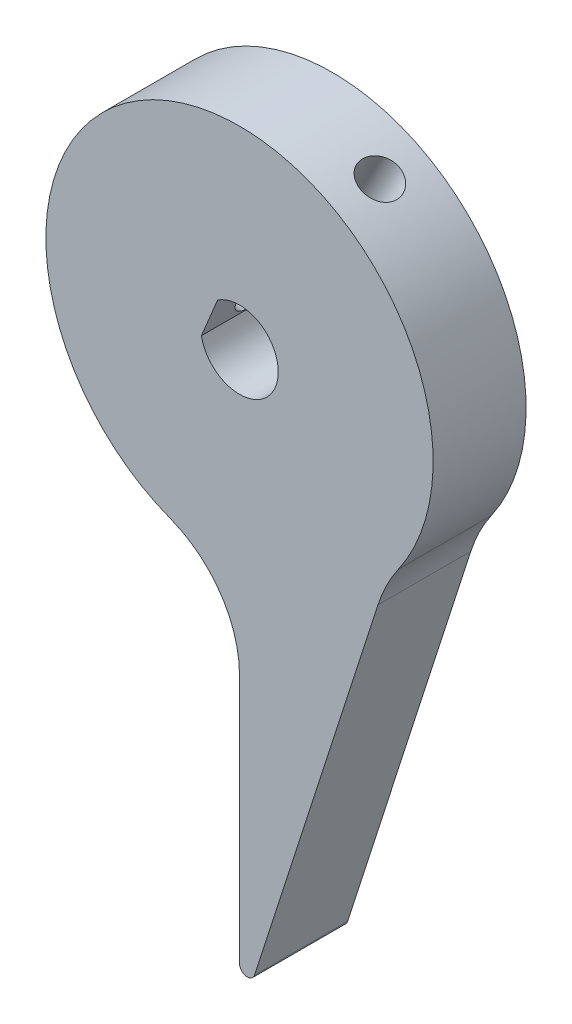
ISO-10303-21;
HEADER;
FILE_DESCRIPTION(('STEP AP214'),'2;1');
FILE_NAME('part.step','',(''),(''),'','','');
FILE_SCHEMA(('AUTOMOTIVE_DESIGN { 1 0 10303 214 1 1 1 1 }'));
ENDSEC;
DATA;
#1=APPLICATION_CONTEXT('core data for automotive mechanical design processes');
#2=APPLICATION_PROTOCOL_DEFINITION('international standard','automotive_design',2000,#1);
#3=PRODUCT_CONTEXT('',#1,'mechanical');
#4=PRODUCT('Part','Part','',(#3));
#5=PRODUCT_RELATED_PRODUCT_CATEGORY('part','',(#4));
#6=PRODUCT_DEFINITION_FORMATION('','',#4);
#7=PRODUCT_DEFINITION_CONTEXT('part definition',#1,'design');
#8=PRODUCT_DEFINITION('design','',#6,#7);
#9=PRODUCT_DEFINITION_SHAPE('','',#8);
#10=(LENGTH_UNIT() NAMED_UNIT(*) SI_UNIT(.MILLI.,.METRE.));
#11=(NAMED_UNIT(*) PLANE_ANGLE_UNIT() SI_UNIT($,.RADIAN.));
#12=(NAMED_UNIT(*) SI_UNIT($,.STERADIAN.) SOLID_ANGLE_UNIT());
#13=UNCERTAINTY_MEASURE_WITH_UNIT(LENGTH_MEASURE(1.E-05),#10,'distance_accuracy_value','');
#14=(GEOMETRIC_REPRESENTATION_CONTEXT(3) GLOBAL_UNCERTAINTY_ASSIGNED_CONTEXT((#13)) GLOBAL_UNIT_ASSIGNED_CONTEXT((#10,
#11,#12)) REPRESENTATION_CONTEXT('',''));
#15=CARTESIAN_POINT('',(0.,0.,0.));
#16=DIRECTION('',(0.,0.,1.));
#17=DIRECTION('',(1.,0.,0.));
#18=AXIS2_PLACEMENT_3D('',#15,#16,#17);
#19=CARTESIAN_POINT('',(0.,0.,6.));
#20=DIRECTION('',(0.,0.,-1.));
#21=DIRECTION('',(-1.,0.,0.));
#22=AXIS2_PLACEMENT_3D('',#19,#20,#21);
#23=CYLINDRICAL_SURFACE('',#22,12.5);
#24=CARTESIAN_POINT('',(4.83008192316227,11.5291070172647,2.88562783262591));
#25=CARTESIAN_POINT('',(4.83008498102637,11.5291062931279,2.81560337740891));
#26=CARTESIAN_POINT('',(4.83555680446129,11.5268180603912,2.74553262211112));
#27=CARTESIAN_POINT('',(4.85727879285265,11.5176810254983,2.607333849759));
#28=CARTESIAN_POINT('',(4.8735408359943,11.5108271973701,2.53920806007905));
#29=CARTESIAN_POINT('',(4.91629503404292,11.4926315347756,2.40692055860354));
#30=CARTESIAN_POINT('',(4.94278098694086,11.4812924210619,2.34275647088662));
#31=CARTESIAN_POINT('',(5.00511263899538,11.4542566765701,2.22016809226123));
#32=CARTESIAN_POINT('',(5.04095647918227,11.4385609112135,2.16174266452127));
#33=CARTESIAN_POINT('',(5.12099457509674,11.4029528467241,2.05206375305405));
#34=CARTESIAN_POINT('',(5.16521545720228,11.3830270774987,2.00083407074619));
#35=CARTESIAN_POINT('',(5.26054945386283,11.3392841170701,1.90720582137146));
#36=CARTESIAN_POINT('',(5.31166288359246,11.3154667479059,1.86480765836803));
#37=CARTESIAN_POINT('',(5.41932540237515,11.2643005316557,1.78996376136698));
#38=CARTESIAN_POINT('',(5.47588566527978,11.2369443837686,1.75753908413384));
#39=CARTESIAN_POINT('',(5.59263359670069,11.1792970796969,1.70369729119007));
#40=CARTESIAN_POINT('',(5.65282117675701,11.149005995076,1.68227990716409));
#41=CARTESIAN_POINT('',(5.77481813682624,11.0863051065985,1.65113044593436));
#42=CARTESIAN_POINT('',(5.83662137822847,11.0539027749228,1.64135929168849));
#43=CARTESIAN_POINT('',(5.96023854542778,10.987741808495,1.63365874620878));
#44=CARTESIAN_POINT('',(6.02205247090628,10.9539832089317,1.63572904794308));
#45=CARTESIAN_POINT('',(6.14371296596344,10.8862125636413,1.65162092343862));
#46=CARTESIAN_POINT('',(6.20356577659686,10.8522018547196,1.66540047708078));
#47=CARTESIAN_POINT('',(6.31989745089216,10.7848697768666,1.7042542438092));
#48=CARTESIAN_POINT('',(6.37637627071648,10.7515484168955,1.72932860361039));
#49=CARTESIAN_POINT('',(6.48456463950349,10.6866464448952,1.79010628669397));
#50=CARTESIAN_POINT('',(6.53626563597518,10.6550689936749,1.82582820453862));
#51=CARTESIAN_POINT('',(6.63346856106343,10.5948275044677,1.90687348679638));
#52=CARTESIAN_POINT('',(6.6789703078051,10.5661635519639,1.9521971328074));
#53=CARTESIAN_POINT('',(6.76283096340755,10.5126879035173,2.05139561951798));
#54=CARTESIAN_POINT('',(6.80115774274507,10.4878936145635,2.10530701355289));
#55=CARTESIAN_POINT('',(6.86948081698688,10.4432707432471,2.22002391413939));
#56=CARTESIAN_POINT('',(6.89947709980733,10.4234421680878,2.2808294306911));
#57=CARTESIAN_POINT('',(6.95041403938181,10.3895469357067,2.40763661412566));
#58=CARTESIAN_POINT('',(6.9713527867547,10.37548149342,2.47363937315453));
#59=CARTESIAN_POINT('',(7.00365277066201,10.3537061336456,2.60895358839428));
#60=CARTESIAN_POINT('',(7.01501429898249,10.3459960225323,2.67826494373522));
#61=CARTESIAN_POINT('',(7.02785363961039,10.3372788644473,2.8179080570378));
#62=CARTESIAN_POINT('',(7.02937397008733,10.3362429820528,2.88823410795696));
#63=CARTESIAN_POINT('',(7.02260690538375,10.3408417613191,3.02819191490449));
#64=CARTESIAN_POINT('',(7.01431964272531,10.3464763328473,3.09782368030137));
#65=CARTESIAN_POINT('',(6.98816774686283,10.3641573348537,3.23426731047384));
#66=CARTESIAN_POINT('',(6.97032328751838,10.3761902589523,3.30108479649424));
#67=CARTESIAN_POINT('',(6.92550113394473,10.406159551739,3.43017789728879));
#68=CARTESIAN_POINT('',(6.89852323050514,10.424096055654,3.49245340798489));
#69=CARTESIAN_POINT('',(6.83597647260333,10.4652198231755,3.61092780016188));
#70=CARTESIAN_POINT('',(6.80037866759688,10.4884247644571,3.66710526008373));
#71=CARTESIAN_POINT('',(6.72150478290738,10.5391444710526,3.77157164921849));
#72=CARTESIAN_POINT('',(6.67822851310682,10.5666593430776,3.819860383051));
#73=CARTESIAN_POINT('',(6.58489556302366,10.6250734727732,3.90735487437352));
#74=CARTESIAN_POINT('',(6.5348150168264,10.6559845661592,3.94652728210868));
#75=CARTESIAN_POINT('',(6.42927139332353,10.7199940910147,4.01444766825892));
#76=CARTESIAN_POINT('',(6.37380838978271,10.7530924925058,4.04319578950979));
#77=CARTESIAN_POINT('',(6.25906775604426,10.820280918058,4.08939504219508));
#78=CARTESIAN_POINT('',(6.1997971366322,10.8543690597102,4.10686631678242));
#79=CARTESIAN_POINT('',(6.07897427283071,10.9224941826057,4.13008166960071));
#80=CARTESIAN_POINT('',(6.01742209261468,10.9565311652601,4.13582607741845));
#81=CARTESIAN_POINT('',(5.89404805318154,11.0233887403156,4.13541999957598));
#82=CARTESIAN_POINT('',(5.83222854121771,11.0562139907114,4.12932128658008));
#83=CARTESIAN_POINT('',(5.70983561665312,11.1199163068812,4.10551065055469));
#84=CARTESIAN_POINT('',(5.6492622050305,11.1507933711259,4.0877987184097));
#85=CARTESIAN_POINT('',(5.5311503788811,11.2098500554962,4.04127876088474));
#86=CARTESIAN_POINT('',(5.47361155161189,11.2380300428859,4.01247224895821));
#87=CARTESIAN_POINT('',(5.36327636095334,11.2911035483715,3.94458637147968));
#88=CARTESIAN_POINT('',(5.31047996981695,11.3159970856962,3.90550706603701));
#89=CARTESIAN_POINT('',(5.21101793392258,11.362143974802,3.81799080884622));
#90=CARTESIAN_POINT('',(5.16437892013845,11.3833816276588,3.76951531231991));
#91=CARTESIAN_POINT('',(5.07893282850418,11.4217617488592,3.6646586431941));
#92=CARTESIAN_POINT('',(5.04012763286553,11.4389032332081,3.60827557616456));
#93=CARTESIAN_POINT('',(4.97151039466087,11.4688924712757,3.48904740522602));
#94=CARTESIAN_POINT('',(4.94172147561769,11.4817291937621,3.42618623097084));
#95=CARTESIAN_POINT('',(4.8922727119482,11.502886494656,3.29594246856812));
#96=CARTESIAN_POINT('',(4.87260144260541,11.5112121674518,3.22856507771877));
#97=CARTESIAN_POINT('',(4.84893775581299,11.5211935010126,3.11494315650202));
#98=CARTESIAN_POINT('',(4.84187770387875,11.524159266341,3.06942501849288));
#99=CARTESIAN_POINT('',(4.83244879070076,11.5281162587204,2.97782055382272));
#100=CARTESIAN_POINT('',(4.8300799097643,11.52910749406,2.93173422954767));
#101=CARTESIAN_POINT('',(4.83008192316227,11.5291070172647,2.88562783262591));
#102=B_SPLINE_CURVE_WITH_KNOTS('',3,(#24,#25,#26,#27,#28,#29,#30,#31,#32,#33,#34,#35,#36,#37,
#38,#39,#40,#41,#42,#43,#44,#45,#46,#47,#48,#49,#50,#51,#52,#53,#54,#55,#56,#57,#58,#59,#60,#61,
#62,#63,#64,#65,#66,#67,#68,#69,#70,#71,#72,#73,#74,#75,#76,#77,#78,#79,#80,#81,#82,#83,#84,#85,
#86,#87,#88,#89,#90,#91,#92,#93,#94,#95,#96,#97,#98,#99,#100,#101),.UNSPECIFIED.,.T.,.F.,(4,2,2,
2,2,2,2,2,2,2,2,2,2,2,2,2,2,2,2,2,2,2,2,2,2,2,2,2,2,2,2,2,2,2,2,2,2,2,4),(0.,0.209904993045576,
0.42004143977721,0.630050613746838,0.840018100526638,1.05066451912406,1.26132057319065,
1.47241837464114,1.68351103009742,1.89389338623061,2.10427028747789,2.31389539773325,
2.52352323101216,2.73351931833015,2.94352156523159,3.1544428135625,3.36536436784451,
3.57633036397415,3.78728993243789,3.99733745384704,4.20738213708585,4.41698518380656,
4.62659303201306,4.83691487264644,5.04724192154,5.25832671022645,5.46940860647503,
5.68011240867948,5.89081028891433,6.100589168356,6.31036821245819,6.52011864994054,
6.72986786013495,6.94049643797481,7.15117556293152,7.36239051338091,7.57336643617497,
7.71157534507554,7.84978367379765),.UNSPECIFIED.);
#103=CARTESIAN_POINT('',(4.83008192316227,11.5291070172647,2.88562783262591));
#104=VERTEX_POINT('',#103);
#105=EDGE_CURVE('E246',#104,#104,#102,.T.);
#106=ORIENTED_EDGE('',*,*,#105,.T.);
#107=EDGE_LOOP('',(#106));
#108=FACE_BOUND('',#107,.T.);
#109=CARTESIAN_POINT('',(-12.2841588961261,2.31288568993941,3.00278912881246));
#110=CARTESIAN_POINT('',(-12.2841588333114,2.31288880235498,2.93268633552358));
#111=CARTESIAN_POINT('',(-12.2830647478211,2.31872049353705,2.86253724912707));
#112=CARTESIAN_POINT('',(-12.2786688088405,2.34188512445788,2.72418161127533));
#113=CARTESIAN_POINT('',(-12.2753645245958,2.35923072691977,2.65597728484858));
#114=CARTESIAN_POINT('',(-12.2665026752015,2.40488034975754,2.52353243884883));
#115=CARTESIAN_POINT('',(-12.2609463561219,2.43317830971065,2.45928974987911));
#116=CARTESIAN_POINT('',(-12.2475239730187,2.49986153693375,2.33655708536055));
#117=CARTESIAN_POINT('',(-12.2396583833311,2.53824473247413,2.27806593170695));
#118=CARTESIAN_POINT('',(-12.2215519814345,2.62404036960094,2.16833873380454));
#119=CARTESIAN_POINT('',(-12.2113060278885,2.67147231530386,2.1171187860171));
#120=CARTESIAN_POINT('',(-12.1884466770949,2.7738989245281,2.02352941627129));
#121=CARTESIAN_POINT('',(-12.1758331933727,2.82889386426985,1.98116031771165));
#122=CARTESIAN_POINT('',(-12.1483077717739,2.9448541647457,1.90645632679665));
#123=CARTESIAN_POINT('',(-12.1333944940308,3.00582299828839,1.87412731712988));
#124=CARTESIAN_POINT('',(-12.1014618946286,3.13190751244149,1.82046689457688));
#125=CARTESIAN_POINT('',(-12.0844426292709,3.19702308217093,1.79913518776868));
#126=CARTESIAN_POINT('',(-12.0486793926174,3.32926388278878,1.76813800903483));
#127=CARTESIAN_POINT('',(-12.0299415851855,3.39638139054787,1.75843247336641));
#128=CARTESIAN_POINT('',(-11.9911478402977,3.53090255144516,1.75082715900062));
#129=CARTESIAN_POINT('',(-11.9710919258071,3.59830619957881,1.75292717466854));
#130=CARTESIAN_POINT('',(-11.9302931867187,3.73134520528183,1.76884229249));
#131=CARTESIAN_POINT('',(-11.9095518838238,3.7969839611716,1.7826329244478));
#132=CARTESIAN_POINT('',(-11.8680359804416,3.92482381666395,1.82148775059521));
#133=CARTESIAN_POINT('',(-11.8472613791728,3.98702483433252,1.84655221335188));
#134=CARTESIAN_POINT('',(-11.8063769641527,4.10651538001529,1.90734011106664));
#135=CARTESIAN_POINT('',(-11.7862697041762,4.16378713722782,1.94310018960208));
#136=CARTESIAN_POINT('',(-11.7476065176142,4.27165416597597,2.02423719368923));
#137=CARTESIAN_POINT('',(-11.7290506430532,4.32224921364643,2.06961444156472));
#138=CARTESIAN_POINT('',(-11.6942082194391,4.41565353066946,2.16895732571006));
#139=CARTESIAN_POINT('',(-11.6779327939961,4.45842492735711,2.22296248489754));
#140=CARTESIAN_POINT('',(-11.6485064529548,4.53475204536636,2.33789439235559));
#141=CARTESIAN_POINT('',(-11.6353555178958,4.56830782408662,2.39882109751259));
#142=CARTESIAN_POINT('',(-11.6128294698246,4.6252711724926,2.52580298340487));
#143=CARTESIAN_POINT('',(-11.6034497430992,4.64869114506724,2.59185177895801));
#144=CARTESIAN_POINT('',(-11.5889160409679,4.6848060208569,2.72726300268144));
#145=CARTESIAN_POINT('',(-11.5837618814016,4.69750139147668,2.7966252863025));
#146=CARTESIAN_POINT('',(-11.5779638717156,4.71177382643589,2.93622608157753));
#147=CARTESIAN_POINT('',(-11.5772917873137,4.71342049114513,3.00645631059357));
#148=CARTESIAN_POINT('',(-11.580417579545,4.70573535690145,3.14621185715681));
#149=CARTESIAN_POINT('',(-11.5842153706403,4.69640376803413,3.21573718816761));
#150=CARTESIAN_POINT('',(-11.5960687467332,4.66705863946237,3.35191093291519));
#151=CARTESIAN_POINT('',(-11.6041123582361,4.64707513730993,3.41856686966948));
#152=CARTESIAN_POINT('',(-11.6240481749717,4.5969801551238,3.5473424865602));
#153=CARTESIAN_POINT('',(-11.6359404900041,4.56686838614003,3.6094620372162));
#154=CARTESIAN_POINT('',(-11.6630636488475,4.49714872102304,3.72771714336369));
#155=CARTESIAN_POINT('',(-11.6783096472357,4.45749764001383,3.78382375855995));
#156=CARTESIAN_POINT('',(-11.7114013637732,4.36981332224144,3.88817000175824));
#157=CARTESIAN_POINT('',(-11.7292471776715,4.32177977674635,3.93640933987643));
#158=CARTESIAN_POINT('',(-11.7668611387438,4.21829598480153,4.02392875421176));
#159=CARTESIAN_POINT('',(-11.7866395217786,4.16280558959053,4.06315697785513));
#160=CARTESIAN_POINT('',(-11.8272094649979,4.0461003077454,4.13119121917144));
#161=CARTESIAN_POINT('',(-11.8480010193052,3.98488545431534,4.15999729729213));
#162=CARTESIAN_POINT('',(-11.8897779399045,3.8584461140992,4.2063356676264));
#163=CARTESIAN_POINT('',(-11.9107631459901,3.79322472636975,4.22387655610505));
#164=CARTESIAN_POINT('',(-11.952204963743,3.66054968625216,4.24719669835432));
#165=CARTESIAN_POINT('',(-11.972661592384,3.59309610570326,4.25297633026712));
#166=CARTESIAN_POINT('',(-12.0123080761021,3.45823214718307,4.25259364834987));
#167=CARTESIAN_POINT('',(-12.0315039485575,3.39082335809485,4.24649308819068));
#168=CARTESIAN_POINT('',(-12.0682462509442,3.25763814226732,4.22264052414598));
#169=CARTESIAN_POINT('',(-12.0857926973787,3.19186169920059,4.20488863685086));
#170=CARTESIAN_POINT('',(-12.118844817683,3.06397739443308,4.15828819262919));
#171=CARTESIAN_POINT('',(-12.134354420428,3.00186260128257,4.1294614328021));
#172=CARTESIAN_POINT('',(-12.1631506848867,2.88296922804501,4.06153102324534));
#173=CARTESIAN_POINT('',(-12.1764373776141,2.8261905735134,4.02242751691565));
#174=CARTESIAN_POINT('',(-12.2007183738453,2.71946335826323,3.93491290434038));
#175=CARTESIAN_POINT('',(-12.2117055396618,2.66953622494487,3.88647368847129));
#176=CARTESIAN_POINT('',(-12.2313183934126,2.57818528163563,3.78171410548467));
#177=CARTESIAN_POINT('',(-12.2399435105081,2.53676352775304,3.7253918382224));
#178=CARTESIAN_POINT('',(-12.2548863802147,2.46356732792801,3.60627890905495));
#179=CARTESIAN_POINT('',(-12.2611969260773,2.43182306517539,3.54346881148088));
#180=CARTESIAN_POINT('',(-12.2715259900344,2.37915462609202,3.41334478546854));
#181=CARTESIAN_POINT('',(-12.2755470598704,2.35821840606844,3.34603596499443));
#182=CARTESIAN_POINT('',(-12.2803586270839,2.3330000641154,3.23242427516418));
#183=CARTESIAN_POINT('',(-12.2817842712307,2.32546805539458,3.18684241378789));
#184=CARTESIAN_POINT('',(-12.2836844251772,2.31540985000057,3.09511010372047));
#185=CARTESIAN_POINT('',(-12.2841589374966,2.31288364006576,3.04895965653598));
#186=CARTESIAN_POINT('',(-12.2841588961261,2.31288568993941,3.00278912881246));
#187=B_SPLINE_CURVE_WITH_KNOTS('',3,(#109,#110,#111,#112,#113,#114,#115,#116,#117,#118,#119,
#120,#121,#122,#123,#124,#125,#126,#127,#128,#129,#130,#131,#132,#133,#134,#135,#136,#137,#138,
#139,#140,#141,#142,#143,#144,#145,#146,#147,#148,#149,#150,#151,#152,#153,#154,#155,#156,#157,
#158,#159,#160,#161,#162,#163,#164,#165,#166,#167,#168,#169,#170,#171,#172,#173,#174,#175,#176,
#177,#178,#179,#180,#181,#182,#183,#184,#185,#186),.UNSPECIFIED.,.T.,.F.,(4,2,2,2,2,2,2,2,2,2,2,
2,2,2,2,2,2,2,2,2,2,2,2,2,2,2,2,2,2,2,2,2,2,2,2,2,2,2,4),(0.,0.210139984421942,
0.420511459500881,0.630766692803002,0.840978768769029,1.05164917282481,1.26232727316242,
1.4731285821259,1.6839242567669,1.8939914211983,2.10405492659113,2.31367982046633,
2.52330970832483,2.73366618702976,2.94402971704225,3.15538607673162,3.36674111997661,
3.57783679791975,3.78892327531503,3.99867877295132,4.20843025666194,4.41759336286511,
4.62676243680447,4.8368968617904,5.04703902780466,5.25836170425533,5.46968315502878,
5.6808431579708,5.89199637169212,6.10205493258717,6.31211139153841,6.52175652676315,
6.73139873679053,6.94168232523269,7.15201668837854,7.36300050702462,7.57374871046178,
7.71214975306316,7.85055042900473),.UNSPECIFIED.);
#188=CARTESIAN_POINT('',(-12.2841588961261,2.31288568993941,3.00278912881246));
#189=VERTEX_POINT('',#188);
#190=EDGE_CURVE('E124',#189,#189,#187,.T.);
#191=ORIENTED_EDGE('',*,*,#190,.T.);
#192=EDGE_LOOP('',(#191));
#193=FACE_BOUND('',#192,.T.);
#194=CARTESIAN_POINT('',(0.,0.,6.));
#195=DIRECTION('',(0.,0.,1.));
#196=DIRECTION('',(1.,0.,0.));
#197=AXIS2_PLACEMENT_3D('',#194,#195,#196);
#198=CIRCLE('',#197,12.5);
#199=CARTESIAN_POINT('',(10.2505858936316,-7.15370455339613,6.));
#200=VERTEX_POINT('',#199);
#201=CARTESIAN_POINT('',(-4.48717948717949,-11.6668427712829,6.));
#202=VERTEX_POINT('',#201);
#203=EDGE_CURVE('E143',#200,#202,#198,.T.);
#204=ORIENTED_EDGE('',*,*,#203,.F.);
#205=DIRECTION('',(0.,0.,-1.));
#206=VECTOR('',#205,1.);
#207=CARTESIAN_POINT('',(10.2505858936316,-7.15370455339614,6.));
#208=LINE('',#207,#206);
#209=CARTESIAN_POINT('',(10.2505858936316,-7.15370455339613,0.));
#210=VERTEX_POINT('',#209);
#211=EDGE_CURVE('E177',#200,#210,#208,.T.);
#212=ORIENTED_EDGE('',*,*,#211,.T.);
#213=CARTESIAN_POINT('',(0.,0.,0.));
#214=DIRECTION('',(0.,0.,1.));
#215=DIRECTION('',(1.,0.,0.));
#216=AXIS2_PLACEMENT_3D('',#213,#214,#215);
#217=CIRCLE('',#216,12.5);
#218=CARTESIAN_POINT('',(-4.48717948717949,-11.6668427712829,0.));
#219=VERTEX_POINT('',#218);
#220=EDGE_CURVE('E114',#210,#219,#217,.T.);
#221=ORIENTED_EDGE('',*,*,#220,.T.);
#222=DIRECTION('',(0.,0.,-1.));
#223=VECTOR('',#222,1.);
#224=CARTESIAN_POINT('',(-4.48717948717949,-11.6668427712829,6.));
#225=LINE('',#224,#223);
#226=EDGE_CURVE('E166',#219,#202,#225,.F.);
#227=ORIENTED_EDGE('',*,*,#226,.T.);
#228=EDGE_LOOP('',(#204,#212,#221,#227));
#229=FACE_BOUND('',#228,.T.);
#230=ADVANCED_FACE('F43',(#108,#193,#229),#23,.T.);
#231=CARTESIAN_POINT('',(0.,-12.5,6.));
#232=DIRECTION('',(1.,0.,0.));
#233=DIRECTION('',(0.,1.,0.));
#234=AXIS2_PLACEMENT_3D('',#231,#232,#233);
#235=PLANE('',#234);
#236=DIRECTION('',(0.,-1.,0.));
#237=VECTOR('',#236,1.);
#238=CARTESIAN_POINT('',(0.,-12.5,0.));
#239=LINE('',#238,#237);
#240=CARTESIAN_POINT('',(0.,-18.2002747232013,0.));
#241=VERTEX_POINT('',#240);
#242=CARTESIAN_POINT('',(0.,-34.3215624336094,0.));
#243=VERTEX_POINT('',#242);
#244=EDGE_CURVE('E157',#241,#243,#239,.T.);
#245=ORIENTED_EDGE('',*,*,#244,.T.);
#246=DIRECTION('',(0.,0.,-1.));
#247=VECTOR('',#246,1.);
#248=CARTESIAN_POINT('',(0.,-34.3215624336094,6.));
#249=LINE('',#248,#247);
#250=CARTESIAN_POINT('',(0.,-34.3215624336094,6.));
#251=VERTEX_POINT('',#250);
#252=EDGE_CURVE('E52',#243,#251,#249,.F.);
#253=ORIENTED_EDGE('',*,*,#252,.T.);
#254=DIRECTION('',(0.,-1.,0.));
#255=VECTOR('',#254,1.);
#256=CARTESIAN_POINT('',(0.,-12.5,6.));
#257=LINE('',#256,#255);
#258=CARTESIAN_POINT('',(0.,-18.2002747232013,6.));
#259=VERTEX_POINT('',#258);
#260=EDGE_CURVE('E146',#259,#251,#257,.T.);
#261=ORIENTED_EDGE('',*,*,#260,.F.);
#262=DIRECTION('',(0.,0.,1.));
#263=VECTOR('',#262,1.);
#264=CARTESIAN_POINT('',(0.,-18.2002747232013,0.));
#265=LINE('',#264,#263);
#266=EDGE_CURVE('E154',#259,#241,#265,.F.);
#267=ORIENTED_EDGE('',*,*,#266,.T.);
#268=EDGE_LOOP('',(#245,#253,#261,#267));
#269=FACE_BOUND('',#268,.T.);
#270=ADVANCED_FACE('F202',(#269),#235,.F.);
#271=CARTESIAN_POINT('',(0.,-37.5,6.));
#272=DIRECTION('',(-0.951702325731451,0.307022284528904,0.));
#273=DIRECTION('',(-0.307022284528904,-0.951702325731451,0.));
#274=AXIS2_PLACEMENT_3D('',#271,#272,#273);
#275=PLANE('',#274);
#276=DIRECTION('',(0.307022284528904,0.951702325731451,0.));
#277=VECTOR('',#276,1.);
#278=CARTESIAN_POINT('',(0.,-37.5,6.));
#279=LINE('',#278,#277);
#280=CARTESIAN_POINT('',(0.975851162865724,-34.4750735758739,6.));
#281=VERTEX_POINT('',#280);
#282=CARTESIAN_POINT('',(8.9340313512224,-9.806445350824,6.));
#283=VERTEX_POINT('',#282);
#284=EDGE_CURVE('E151',#281,#283,#279,.T.);
#285=ORIENTED_EDGE('',*,*,#284,.F.);
#286=DIRECTION('',(0.,0.,-1.));
#287=VECTOR('',#286,1.);
#288=CARTESIAN_POINT('',(0.975851162865724,-34.4750735758739,6.));
#289=LINE('',#288,#287);
#290=CARTESIAN_POINT('',(0.975851162865724,-34.4750735758739,0.));
#291=VERTEX_POINT('',#290);
#292=EDGE_CURVE('E192',#281,#291,#289,.T.);
#293=ORIENTED_EDGE('',*,*,#292,.T.);
#294=DIRECTION('',(0.307022284528904,0.951702325731451,0.));
#295=VECTOR('',#294,1.);
#296=CARTESIAN_POINT('',(0.,-37.5,0.));
#297=LINE('',#296,#295);
#298=CARTESIAN_POINT('',(8.9340313512224,-9.806445350824,0.));
#299=VERTEX_POINT('',#298);
#300=EDGE_CURVE('E147',#291,#299,#297,.T.);
#301=ORIENTED_EDGE('',*,*,#300,.T.);
#302=DIRECTION('',(0.,0.,1.));
#303=VECTOR('',#302,1.);
#304=CARTESIAN_POINT('',(8.9340313512224,-9.80644535082401,6.));
#305=LINE('',#304,#303);
#306=EDGE_CURVE('E181',#299,#283,#305,.T.);
#307=ORIENTED_EDGE('',*,*,#306,.T.);
#308=EDGE_LOOP('',(#285,#293,#301,#307));
#309=FACE_BOUND('',#308,.T.);
#310=ADVANCED_FACE('F212',(#309),#275,.F.);
#311=CARTESIAN_POINT('',(0.,0.,6.));
#312=DIRECTION('',(0.,0.,1.));
#313=DIRECTION('',(1.,0.,0.));
#314=AXIS2_PLACEMENT_3D('',#311,#312,#313);
#315=PLANE('',#314);
#316=CARTESIAN_POINT('',(0.,0.,6.));
#317=DIRECTION('',(0.,0.,1.));
#318=DIRECTION('',(1.,0.,0.));
#319=AXIS2_PLACEMENT_3D('',#316,#317,#318);
#320=CIRCLE('',#319,2.5);
#321=CARTESIAN_POINT('',(-1.41903781636728,2.05823508757372,6.));
#322=VERTEX_POINT('',#321);
#323=CARTESIAN_POINT('',(-2.45968256117634,-0.447170770785617,6.));
#324=VERTEX_POINT('',#323);
#325=EDGE_CURVE('E117',#322,#324,#320,.F.);
#326=ORIENTED_EDGE('',*,*,#325,.T.);
#327=DIRECTION('',(0.383586742092405,0.923504851796099,0.));
#328=VECTOR('',#327,1.);
#329=CARTESIAN_POINT('',(-1.41903781636728,2.05823508757372,6.));
#330=LINE('',#329,#328);
#331=EDGE_CURVE('E107',#324,#322,#330,.T.);
#332=ORIENTED_EDGE('',*,*,#331,.T.);
#333=EDGE_LOOP('',(#326,#332));
#334=FACE_BOUND('',#333,.T.);
#335=ORIENTED_EDGE('',*,*,#260,.T.);
#336=CARTESIAN_POINT('',(0.5,-34.3215624336094,6.));
#337=DIRECTION('',(0.,0.,1.));
#338=DIRECTION('',(1.,0.,0.));
#339=AXIS2_PLACEMENT_3D('',#336,#337,#338);
#340=CIRCLE('',#339,0.5);
#341=EDGE_CURVE('E11',#251,#281,#340,.T.);
#342=ORIENTED_EDGE('',*,*,#341,.T.);
#343=ORIENTED_EDGE('',*,*,#284,.T.);
#344=CARTESIAN_POINT('',(18.4510546085369,-12.876668196113,6.));
#345=DIRECTION('',(0.,0.,1.));
#346=DIRECTION('',(1.,0.,0.));
#347=AXIS2_PLACEMENT_3D('',#344,#345,#346);
#348=CIRCLE('',#347,10.);
#349=EDGE_CURVE('E189',#283,#200,#348,.F.);
#350=ORIENTED_EDGE('',*,*,#349,.T.);
#351=ORIENTED_EDGE('',*,*,#203,.T.);
#352=CARTESIAN_POINT('',(-7.,-18.2002747232013,6.));
#353=DIRECTION('',(0.,0.,1.));
#354=DIRECTION('',(1.,0.,0.));
#355=AXIS2_PLACEMENT_3D('',#352,#353,#354);
#356=CIRCLE('',#355,7.);
#357=EDGE_CURVE('E174',#202,#259,#356,.F.);
#358=ORIENTED_EDGE('',*,*,#357,.T.);
#359=EDGE_LOOP('',(#335,#342,#343,#350,#351,#358));
#360=FACE_BOUND('',#359,.T.);
#361=ADVANCED_FACE('F121',(#334,#360),#315,.T.);
#362=CARTESIAN_POINT('',(0.,0.,0.));
#363=DIRECTION('',(0.,0.,1.));
#364=DIRECTION('',(1.,0.,0.));
#365=AXIS2_PLACEMENT_3D('',#362,#363,#364);
#366=PLANE('',#365);
#367=DIRECTION('',(0.383586742092405,0.923504851796099,0.));
#368=VECTOR('',#367,1.);
#369=CARTESIAN_POINT('',(-1.41903781636728,2.05823508757372,0.));
#370=LINE('',#369,#368);
#371=CARTESIAN_POINT('',(-2.45968256117634,-0.447170770785617,0.));
#372=VERTEX_POINT('',#371);
#373=CARTESIAN_POINT('',(-1.41903781636728,2.05823508757372,0.));
#374=VERTEX_POINT('',#373);
#375=EDGE_CURVE('E119',#372,#374,#370,.T.);
#376=ORIENTED_EDGE('',*,*,#375,.F.);
#377=CARTESIAN_POINT('',(0.,0.,0.));
#378=DIRECTION('',(0.,0.,-1.));
#379=DIRECTION('',(-1.,0.,0.));
#380=AXIS2_PLACEMENT_3D('',#377,#378,#379);
#381=CIRCLE('',#380,2.5);
#382=EDGE_CURVE('E66',#374,#372,#381,.T.);
#383=ORIENTED_EDGE('',*,*,#382,.F.);
#384=EDGE_LOOP('',(#376,#383));
#385=FACE_BOUND('',#384,.T.);
#386=ORIENTED_EDGE('',*,*,#300,.F.);
#387=CARTESIAN_POINT('',(0.5,-34.3215624336094,0.));
#388=DIRECTION('',(0.,0.,1.));
#389=DIRECTION('',(1.,0.,0.));
#390=AXIS2_PLACEMENT_3D('',#387,#388,#389);
#391=CIRCLE('',#390,0.5);
#392=EDGE_CURVE('E196',#291,#243,#391,.F.);
#393=ORIENTED_EDGE('',*,*,#392,.T.);
#394=ORIENTED_EDGE('',*,*,#244,.F.);
#395=CARTESIAN_POINT('',(-7.,-18.2002747232013,0.));
#396=DIRECTION('',(0.,0.,1.));
#397=DIRECTION('',(1.,0.,0.));
#398=AXIS2_PLACEMENT_3D('',#395,#396,#397);
#399=CIRCLE('',#398,7.);
#400=EDGE_CURVE('E170',#241,#219,#399,.T.);
#401=ORIENTED_EDGE('',*,*,#400,.T.);
#402=ORIENTED_EDGE('',*,*,#220,.F.);
#403=CARTESIAN_POINT('',(18.4510546085369,-12.876668196113,0.));
#404=DIRECTION('',(0.,0.,1.));
#405=DIRECTION('',(1.,0.,0.));
#406=AXIS2_PLACEMENT_3D('',#403,#404,#405);
#407=CIRCLE('',#406,10.);
#408=EDGE_CURVE('E185',#210,#299,#407,.T.);
#409=ORIENTED_EDGE('',*,*,#408,.T.);
#410=EDGE_LOOP('',(#386,#393,#394,#401,#402,#409));
#411=FACE_BOUND('',#410,.T.);
#412=ADVANCED_FACE('F214',(#385,#411),#366,.F.);
#413=CARTESIAN_POINT('',(-7.,-18.2002747232013,6.));
#414=DIRECTION('',(0.,0.,-1.));
#415=DIRECTION('',(-1.,0.,0.));
#416=AXIS2_PLACEMENT_3D('',#413,#414,#415);
#417=CYLINDRICAL_SURFACE('',#416,7.);
#418=ORIENTED_EDGE('',*,*,#357,.F.);
#419=ORIENTED_EDGE('',*,*,#226,.F.);
#420=ORIENTED_EDGE('',*,*,#400,.F.);
#421=ORIENTED_EDGE('',*,*,#266,.F.);
#422=EDGE_LOOP('',(#418,#419,#420,#421));
#423=FACE_BOUND('',#422,.T.);
#424=ADVANCED_FACE('F225',(#423),#417,.F.);
#425=CARTESIAN_POINT('',(18.4510546085369,-12.876668196113,6.));
#426=DIRECTION('',(0.,0.,-1.));
#427=DIRECTION('',(-1.,0.,0.));
#428=AXIS2_PLACEMENT_3D('',#425,#426,#427);
#429=CYLINDRICAL_SURFACE('',#428,10.);
#430=ORIENTED_EDGE('',*,*,#349,.F.);
#431=ORIENTED_EDGE('',*,*,#306,.F.);
#432=ORIENTED_EDGE('',*,*,#408,.F.);
#433=ORIENTED_EDGE('',*,*,#211,.F.);
#434=EDGE_LOOP('',(#430,#431,#432,#433));
#435=FACE_BOUND('',#434,.T.);
#436=ADVANCED_FACE('F220',(#435),#429,.F.);
#437=CARTESIAN_POINT('',(0.5,-34.3215624336094,6.));
#438=DIRECTION('',(0.,0.,-1.));
#439=DIRECTION('',(-1.,0.,0.));
#440=AXIS2_PLACEMENT_3D('',#437,#438,#439);
#441=CYLINDRICAL_SURFACE('',#440,0.5);
#442=ORIENTED_EDGE('',*,*,#341,.F.);
#443=ORIENTED_EDGE('',*,*,#252,.F.);
#444=ORIENTED_EDGE('',*,*,#392,.F.);
#445=ORIENTED_EDGE('',*,*,#292,.F.);
#446=EDGE_LOOP('',(#442,#443,#444,#445));
#447=FACE_BOUND('',#446,.T.);
#448=ADVANCED_FACE('F45',(#447),#441,.T.);
#449=CARTESIAN_POINT('',(0.,0.,6.001));
#450=DIRECTION('',(0.,0.,-1.));
#451=DIRECTION('',(-1.,0.,0.));
#452=AXIS2_PLACEMENT_3D('',#449,#450,#451);
#453=CYLINDRICAL_SURFACE('',#452,2.5);
#454=CARTESIAN_POINT('',(-0.0667396080284738,2.49910900617004,2.88562783262591));
#455=CARTESIAN_POINT('',(-0.0667329065451717,2.49911182738526,2.95076259286998));
#456=CARTESIAN_POINT('',(-0.0608118865087518,2.49928902202898,3.01597959703222));
#457=CARTESIAN_POINT('',(-0.0375628329933872,2.49974312210854,3.14441191347235));
#458=CARTESIAN_POINT('',(-0.0202108300867489,2.50002023651046,3.20762272643017));
#459=CARTESIAN_POINT('',(0.0245952452380314,2.49997784796523,3.32994241305584));
#460=CARTESIAN_POINT('',(0.0519955983680381,2.49966148146444,3.3890711482179));
#461=CARTESIAN_POINT('',(0.115459275496755,2.49753361959984,3.50240808512181));
#462=CARTESIAN_POINT('',(0.151523068144866,2.49572204333963,3.55661602045398));
#463=CARTESIAN_POINT('',(0.234181348076588,2.48938000052823,3.66350999332279));
#464=CARTESIAN_POINT('',(0.281399057498047,2.48463760891487,3.71570175221784));
#465=CARTESIAN_POINT('',(0.382675442440691,2.47106668611041,3.8123883181343));
#466=CARTESIAN_POINT('',(0.436737507156197,2.46223612474028,3.85687928585531));
#467=CARTESIAN_POINT('',(0.553882696471741,2.43865012608957,3.93983677156049));
#468=CARTESIAN_POINT('',(0.617328262121446,2.4235354328771,3.97769504245032));
#469=CARTESIAN_POINT('',(0.747887669734837,2.38647345227513,4.04205389918311));
#470=CARTESIAN_POINT('',(0.814999166403426,2.36453049205198,4.06856165279737));
#471=CARTESIAN_POINT('',(0.945490710225446,2.31528807158974,4.10750865925228));
#472=CARTESIAN_POINT('',(1.0087964842898,2.28848084609214,4.12081474057032));
#473=CARTESIAN_POINT('',(1.13403526921658,2.22907071298307,4.13583548096971));
#474=CARTESIAN_POINT('',(1.19596908805959,2.19647132440579,4.13755715362054));
#475=CARTESIAN_POINT('',(1.31103133374505,2.12961046052047,4.12969449016297));
#476=CARTESIAN_POINT('',(1.36445712993074,2.09574004354167,4.12108031322438));
#477=CARTESIAN_POINT('',(1.46701076090732,2.02527798403257,4.09452677774509));
#478=CARTESIAN_POINT('',(1.51613827376244,1.98868613804991,4.07658672140563));
#479=CARTESIAN_POINT('',(1.60982182069786,1.91366882737685,4.03177462501364));
#480=CARTESIAN_POINT('',(1.65430520243372,1.87522499815889,4.00478244116082));
#481=CARTESIAN_POINT('',(1.73742936785176,1.7984838373762,3.94279856237404));
#482=CARTESIAN_POINT('',(1.77606805154985,1.76018656326276,3.90780400349797));
#483=CARTESIAN_POINT('',(1.85070167213513,1.68169739280961,3.82700864320964));
#484=CARTESIAN_POINT('',(1.8861014493368,1.64166860531439,3.7804990472184));
#485=CARTESIAN_POINT('',(1.94973287822946,1.56556930665332,3.67989067646319));
#486=CARTESIAN_POINT('',(1.97795901990742,1.52950185015597,3.62578611728333));
#487=CARTESIAN_POINT('',(2.02887895272338,1.46136031946913,3.5073175920958));
#488=CARTESIAN_POINT('',(2.05110758960974,1.42968529109744,3.44252030380814));
#489=CARTESIAN_POINT('',(2.08753091456052,1.37596459957024,3.30695574342716));
#490=CARTESIAN_POINT('',(2.10173398772956,1.3539088916732,3.23619479135396));
#491=CARTESIAN_POINT('',(2.1212421496391,1.3231181903769,3.09660969352242));
#492=CARTESIAN_POINT('',(2.12716317125476,1.31346609562252,3.02807643382147));
#493=CARTESIAN_POINT('',(2.13206957416969,1.30549102743413,2.89012615573023));
#494=CARTESIAN_POINT('',(2.13105985468296,1.30716005129881,2.82070979622618));
#495=CARTESIAN_POINT('',(2.12262414614257,1.32080033796986,2.6910604344025));
#496=CARTESIAN_POINT('',(2.11591212192291,1.3316246563775,2.630653518741));
#497=CARTESIAN_POINT('',(2.0970708476063,1.36110156435032,2.51266809978722));
#498=CARTESIAN_POINT('',(2.08493984312557,1.379756689005,2.45509051919265));
#499=CARTESIAN_POINT('',(2.05461652530245,1.42453897762534,2.34136366899755));
#500=CARTESIAN_POINT('',(2.03616950333507,1.45097219361698,2.28540406155897));
#501=CARTESIAN_POINT('',(1.9933782342739,1.50922121725301,2.17879124320217));
#502=CARTESIAN_POINT('',(1.96903095684911,1.54103978823834,2.12814077823431));
#503=CARTESIAN_POINT('',(1.9109182458486,1.61269184231593,2.02690437322148));
#504=CARTESIAN_POINT('',(1.87635248190824,1.65303005242007,1.97713139422884));
#505=CARTESIAN_POINT('',(1.79958310917881,1.73629104952751,1.88636253513393));
#506=CARTESIAN_POINT('',(1.75737692926309,1.77921470332099,1.84536961983774));
#507=CARTESIAN_POINT('',(1.6642740301811,1.86664694523493,1.77241067518829));
#508=CARTESIAN_POINT('',(1.61317734945326,1.91116746510134,1.74071143486228));
#509=CARTESIAN_POINT('',(1.50387277139022,1.99830802062154,1.68920545280418));
#510=CARTESIAN_POINT('',(1.44567117259191,2.04092969450233,1.66938826841804));
#511=CARTESIAN_POINT('',(1.32930425263189,2.11834374888408,1.64391712740759));
#512=CARTESIAN_POINT('',(1.27162557716985,2.15349567516049,1.63713048778078));
#513=CARTESIAN_POINT('',(1.1534098359677,2.21905543939119,1.63457375080792));
#514=CARTESIAN_POINT('',(1.0928737781331,2.24946493412686,1.63879979697147));
#515=CARTESIAN_POINT('',(0.975029131785845,2.30287465599653,1.65739834112045));
#516=CARTESIAN_POINT('',(0.917770723373202,2.32623107239983,1.67108389419801));
#517=CARTESIAN_POINT('',(0.804228585851224,2.36788422016542,1.70728658175464));
#518=CARTESIAN_POINT('',(0.747944997726699,2.38618022529248,1.72980498274274));
#519=CARTESIAN_POINT('',(0.635535864744088,2.4186076885386,1.78403664783339));
#520=CARTESIAN_POINT('',(0.579520039289542,2.43252755846348,1.81610198663572));
#521=CARTESIAN_POINT('',(0.471723896043801,2.45571202176857,1.88807524619974));
#522=CARTESIAN_POINT('',(0.419945539128481,2.46497447002547,1.92798676902051));
#523=CARTESIAN_POINT('',(0.317123032338519,2.48040256606177,2.0191242564043));
#524=CARTESIAN_POINT('',(0.266664777754386,2.48616828183851,2.07108094197241));
#525=CARTESIAN_POINT('',(0.174313316145244,2.49434758800556,2.18244123403813));
#526=CARTESIAN_POINT('',(0.132427691460341,2.4967582217203,2.24185135871053));
#527=CARTESIAN_POINT('',(0.0580533469225902,2.49961231429386,2.36892364085212));
#528=CARTESIAN_POINT('',(0.0259034174786524,2.49999119923369,2.43678724653684));
#529=CARTESIAN_POINT('',(-0.024842249340978,2.50000867610135,2.57729333805064));
#530=CARTESIAN_POINT('',(-0.0434833108521663,2.49964975915706,2.64991894376678));
#531=CARTESIAN_POINT('',(-0.0586181141403745,2.49931474920641,2.75038452719091));
#532=CARTESIAN_POINT('',(-0.0616575233153197,2.49924035088495,2.77733770062327));
#533=CARTESIAN_POINT('',(-0.0657197329469265,2.49913689047946,2.83139843347872));
#534=CARTESIAN_POINT('',(-0.0667423984968344,2.49910783142835,2.85850600310826));
#535=CARTESIAN_POINT('',(-0.0667396080284738,2.49910900617004,2.88562783262591));
#536=B_SPLINE_CURVE_WITH_KNOTS('',3,(#454,#455,#456,#457,#458,#459,#460,#461,#462,#463,#464,
#465,#466,#467,#468,#469,#470,#471,#472,#473,#474,#475,#476,#477,#478,#479,#480,#481,#482,#483,
#484,#485,#486,#487,#488,#489,#490,#491,#492,#493,#494,#495,#496,#497,#498,#499,#500,#501,#502,
#503,#504,#505,#506,#507,#508,#509,#510,#511,#512,#513,#514,#515,#516,#517,#518,#519,#520,#521,
#522,#523,#524,#525,#526,#527,#528,#529,#530,#531,#532,#533,#534,#535),.UNSPECIFIED.,.T.,.F.,(4,
2,2,2,2,2,2,2,2,2,2,2,2,2,2,2,2,2,2,2,2,2,2,2,2,2,2,2,2,2,2,2,2,2,2,2,2,2,2,2,4),(0.,
0.195290153243393,0.390991116031004,0.585660744898604,0.780340906806433,0.991077890622787,
1.20191963855463,1.42697365298454,1.65188533704863,1.86079356209918,2.06957529607549,
2.26020121855672,2.45084140646818,2.64411918413932,2.83746624187838,3.04908989321112,
3.26087560307396,3.48611052161809,3.71110967764629,3.91827863567763,4.12530116485464,
4.30967729280029,4.49411315545076,4.68709120507607,4.88016857775057,5.09758429475764,
5.3150733122275,5.53830226766204,5.76133474760961,5.96390337986855,6.16640108492461,
6.35555531089362,6.54473666890012,6.74200938399336,6.93937287625895,7.1563780231258,
7.37357428556439,7.59763436298252,7.82093916253446,7.90225168981632,7.98356965618171),.UNSPECIFIED.);
#537=CARTESIAN_POINT('',(-0.0667396080284738,2.49910900617004,2.88562783262591));
#538=VERTEX_POINT('',#537);
#539=EDGE_CURVE('E253',#538,#538,#536,.T.);
#540=ORIENTED_EDGE('',*,*,#539,.T.);
#541=EDGE_LOOP('',(#540));
#542=FACE_BOUND('',#541,.T.);
#543=DIRECTION('',(0.,0.,-1.));
#544=VECTOR('',#543,1.);
#545=CARTESIAN_POINT('',(-1.41903781636728,2.05823508757372,6.001));
#546=LINE('',#545,#544);
#547=EDGE_CURVE('E59',#322,#374,#546,.T.);
#548=ORIENTED_EDGE('',*,*,#547,.T.);
#549=ORIENTED_EDGE('',*,*,#382,.T.);
#550=DIRECTION('',(0.,0.,-1.));
#551=VECTOR('',#550,1.);
#552=CARTESIAN_POINT('',(-2.45968256117634,-0.447170770785617,6.001));
#553=LINE('',#552,#551);
#554=EDGE_CURVE('E109',#324,#372,#553,.T.);
#555=ORIENTED_EDGE('',*,*,#554,.F.);
#556=ORIENTED_EDGE('',*,*,#325,.F.);
#557=EDGE_LOOP('',(#548,#549,#555,#556));
#558=FACE_BOUND('',#557,.T.);
#559=ADVANCED_FACE('F116',(#542,#558),#453,.F.);
#560=CARTESIAN_POINT('',(-1.41903781636728,2.05823508757372,6.001));
#561=DIRECTION('',(-0.923504851796099,0.383586742092405,0.));
#562=DIRECTION('',(-0.383586742092405,-0.923504851796099,0.));
#563=AXIS2_PLACEMENT_3D('',#560,#561,#562);
#564=PLANE('',#563);
#565=CARTESIAN_POINT('',(-1.9473892445671,0.786201792746256,3.00278912881246));
#566=DIRECTION('',(-0.923504851796099,0.383586742092405,0.));
#567=DIRECTION('',(-0.383586742092405,-0.923504851796099,0.));
#568=AXIS2_PLACEMENT_3D('',#565,#566,#567);
#569=ELLIPSE('',#568,1.26016904231006,1.24999999999999);
#570=CARTESIAN_POINT('',(-2.43077338199252,-0.377570431910324,3.00278912881246));
#571=VERTEX_POINT('',#570);
#572=EDGE_CURVE('E130',#571,#571,#569,.T.);
#573=ORIENTED_EDGE('',*,*,#572,.T.);
#574=EDGE_LOOP('',(#573));
#575=FACE_BOUND('',#574,.T.);
#576=ORIENTED_EDGE('',*,*,#554,.T.);
#577=ORIENTED_EDGE('',*,*,#375,.T.);
#578=ORIENTED_EDGE('',*,*,#547,.F.);
#579=ORIENTED_EDGE('',*,*,#331,.F.);
#580=EDGE_LOOP('',(#576,#577,#578,#579));
#581=FACE_BOUND('',#580,.T.);
#582=ADVANCED_FACE('F108',(#575,#581),#564,.F.);
#583=CARTESIAN_POINT('',(-11.993901037881,3.5293908335877,3.00278912881246));
#584=DIRECTION('',(-0.964685016277211,0.263406187038644,0.));
#585=DIRECTION('',(-0.263406187038644,-0.964685016277211,0.));
#586=AXIS2_PLACEMENT_3D('',#583,#584,#585);
#587=CYLINDRICAL_SURFACE('',#586,1.24999999999999);
#588=ORIENTED_EDGE('',*,*,#572,.F.);
#589=EDGE_LOOP('',(#588));
#590=FACE_BOUND('',#589,.T.);
#591=ORIENTED_EDGE('',*,*,#190,.F.);
#592=EDGE_LOOP('',(#591));
#593=FACE_BOUND('',#592,.T.);
#594=ADVANCED_FACE('F261',(#590,#593),#587,.F.);
#595=CARTESIAN_POINT('',(5.9587815354687,10.9883084509199,2.88562783262591));
#596=DIRECTION('',(0.476702522837496,0.87906467607359,0.));
#597=DIRECTION('',(-0.87906467607359,0.476702522837496,0.));
#598=AXIS2_PLACEMENT_3D('',#595,#596,#597);
#599=CYLINDRICAL_SURFACE('',#598,1.24999999999999);
#600=ORIENTED_EDGE('',*,*,#539,.F.);
#601=EDGE_LOOP('',(#600));
#602=FACE_BOUND('',#601,.T.);
#603=ORIENTED_EDGE('',*,*,#105,.F.);
#604=EDGE_LOOP('',(#603));
#605=FACE_BOUND('',#604,.T.);
#606=ADVANCED_FACE('F258',(#602,#605),#599,.F.);
#607=CLOSED_SHELL('',(#230,#270,#310,#361,#412,#424,#436,#448,#559,#582,#594,#606));
#608=MANIFOLD_SOLID_BREP('B2',#607);
#609=ADVANCED_BREP_SHAPE_REPRESENTATION('',(#18,#608),#14);
#610=SHAPE_DEFINITION_REPRESENTATION(#9,#609);
ENDSEC;
END-ISO-10303-21;
